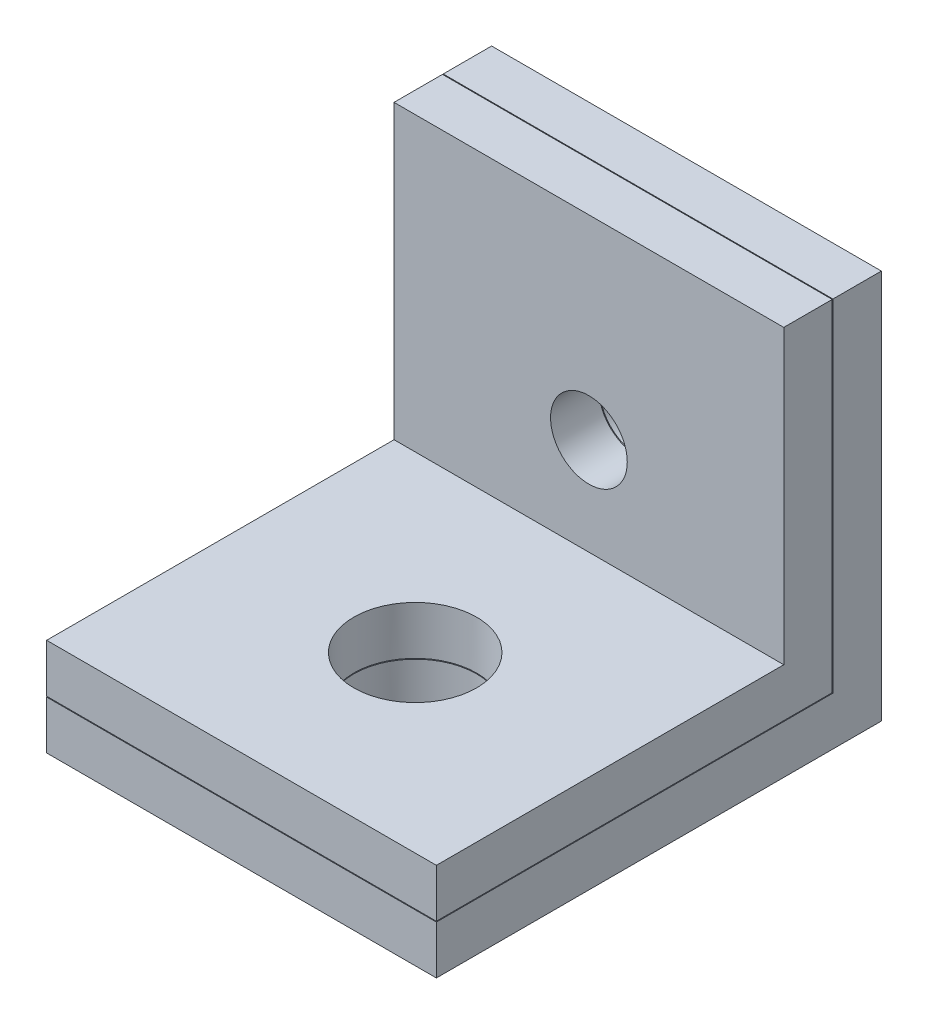
ISO-10303-21;
HEADER;
FILE_DESCRIPTION(('STEP AP214'),'2;1');
FILE_NAME('part.step','',(''),(''),'','','');
FILE_SCHEMA(('AUTOMOTIVE_DESIGN { 1 0 10303 214 1 1 1 1 }'));
ENDSEC;
DATA;
#1=APPLICATION_CONTEXT('core data for automotive mechanical design processes');
#2=APPLICATION_PROTOCOL_DEFINITION('international standard','automotive_design',2000,#1);
#3=PRODUCT_CONTEXT('',#1,'mechanical');
#4=PRODUCT('Part','Part','',(#3));
#5=PRODUCT_RELATED_PRODUCT_CATEGORY('part','',(#4));
#6=PRODUCT_DEFINITION_FORMATION('','',#4);
#7=PRODUCT_DEFINITION_CONTEXT('part definition',#1,'design');
#8=PRODUCT_DEFINITION('design','',#6,#7);
#9=PRODUCT_DEFINITION_SHAPE('','',#8);
#10=(LENGTH_UNIT() NAMED_UNIT(*) SI_UNIT(.MILLI.,.METRE.));
#11=(NAMED_UNIT(*) PLANE_ANGLE_UNIT() SI_UNIT($,.RADIAN.));
#12=(NAMED_UNIT(*) SI_UNIT($,.STERADIAN.) SOLID_ANGLE_UNIT());
#13=UNCERTAINTY_MEASURE_WITH_UNIT(LENGTH_MEASURE(1.E-05),#10,'distance_accuracy_value','');
#14=(GEOMETRIC_REPRESENTATION_CONTEXT(3) GLOBAL_UNCERTAINTY_ASSIGNED_CONTEXT((#13)) GLOBAL_UNIT_ASSIGNED_CONTEXT((#10,
#11,#12)) REPRESENTATION_CONTEXT('',''));
#15=CARTESIAN_POINT('',(0.,0.,0.));
#16=DIRECTION('',(0.,0.,1.));
#17=DIRECTION('',(1.,0.,0.));
#18=AXIS2_PLACEMENT_3D('',#15,#16,#17);
#19=CARTESIAN_POINT('',(50.8,50.8,-51.59));
#20=DIRECTION('',(0.,1.,0.));
#21=DIRECTION('',(0.,0.,1.));
#22=AXIS2_PLACEMENT_3D('',#19,#20,#21);
#23=PLANE('',#22);
#24=DIRECTION('',(0.,0.,-1.));
#25=VECTOR('',#24,1.);
#26=CARTESIAN_POINT('',(0.,50.8,-51.59));
#27=LINE('',#26,#25);
#28=CARTESIAN_POINT('',(0.,50.8,-45.28));
#29=VERTEX_POINT('',#28);
#30=CARTESIAN_POINT('',(0.,50.8,-51.59));
#31=VERTEX_POINT('',#30);
#32=EDGE_CURVE('E128',#29,#31,#27,.T.);
#33=ORIENTED_EDGE('',*,*,#32,.F.);
#34=DIRECTION('',(-1.,0.,0.));
#35=VECTOR('',#34,1.);
#36=CARTESIAN_POINT('',(50.8,50.8,-45.28));
#37=LINE('',#36,#35);
#38=CARTESIAN_POINT('',(50.8,50.8,-45.28));
#39=VERTEX_POINT('',#38);
#40=EDGE_CURVE('E12',#39,#29,#37,.T.);
#41=ORIENTED_EDGE('',*,*,#40,.F.);
#42=DIRECTION('',(0.,0.,-1.));
#43=VECTOR('',#42,1.);
#44=CARTESIAN_POINT('',(50.8,50.8,-51.59));
#45=LINE('',#44,#43);
#46=CARTESIAN_POINT('',(50.8,50.8,-51.59));
#47=VERTEX_POINT('',#46);
#48=EDGE_CURVE('E143',#39,#47,#45,.T.);
#49=ORIENTED_EDGE('',*,*,#48,.T.);
#50=DIRECTION('',(-1.,0.,0.));
#51=VECTOR('',#50,1.);
#52=CARTESIAN_POINT('',(50.8,50.8,-51.59));
#53=LINE('',#52,#51);
#54=EDGE_CURVE('E92',#47,#31,#53,.T.);
#55=ORIENTED_EDGE('',*,*,#54,.T.);
#56=EDGE_LOOP('',(#33,#41,#49,#55));
#57=FACE_BOUND('',#56,.T.);
#58=ADVANCED_FACE('F42',(#57),#23,.T.);
#59=CARTESIAN_POINT('',(50.8,12.72,-45.28));
#60=DIRECTION('',(0.,0.,1.));
#61=DIRECTION('',(1.,0.,0.));
#62=AXIS2_PLACEMENT_3D('',#59,#60,#61);
#63=PLANE('',#62);
#64=CARTESIAN_POINT('',(25.4,25.4,-45.28));
#65=DIRECTION('',(0.,0.,1.));
#66=DIRECTION('',(1.,0.,0.));
#67=AXIS2_PLACEMENT_3D('',#64,#65,#66);
#68=CIRCLE('',#67,5.);
#69=CARTESIAN_POINT('',(30.4,25.4,-45.28));
#70=VERTEX_POINT('',#69);
#71=EDGE_CURVE('E154',#70,#70,#68,.T.);
#72=ORIENTED_EDGE('',*,*,#71,.F.);
#73=EDGE_LOOP('',(#72));
#74=FACE_BOUND('',#73,.T.);
#75=DIRECTION('',(0.,1.,0.));
#76=VECTOR('',#75,1.);
#77=CARTESIAN_POINT('',(0.,12.72,-45.28));
#78=LINE('',#77,#76);
#79=CARTESIAN_POINT('',(0.,12.72,-45.28));
#80=VERTEX_POINT('',#79);
#81=EDGE_CURVE('E141',#80,#29,#78,.T.);
#82=ORIENTED_EDGE('',*,*,#81,.F.);
#83=DIRECTION('',(-1.,0.,0.));
#84=VECTOR('',#83,1.);
#85=CARTESIAN_POINT('',(50.8,12.72,-45.28));
#86=LINE('',#85,#84);
#87=CARTESIAN_POINT('',(50.8,12.72,-45.28));
#88=VERTEX_POINT('',#87);
#89=EDGE_CURVE('E51',#88,#80,#86,.T.);
#90=ORIENTED_EDGE('',*,*,#89,.F.);
#91=DIRECTION('',(0.,1.,0.));
#92=VECTOR('',#91,1.);
#93=CARTESIAN_POINT('',(50.8,12.72,-45.28));
#94=LINE('',#93,#92);
#95=EDGE_CURVE('E118',#88,#39,#94,.T.);
#96=ORIENTED_EDGE('',*,*,#95,.T.);
#97=ORIENTED_EDGE('',*,*,#40,.T.);
#98=EDGE_LOOP('',(#82,#90,#96,#97));
#99=FACE_BOUND('',#98,.T.);
#100=ADVANCED_FACE('F165',(#74,#99),#63,.T.);
#101=CARTESIAN_POINT('',(50.8,12.72,0.));
#102=DIRECTION('',(0.,1.,0.));
#103=DIRECTION('',(0.,0.,1.));
#104=AXIS2_PLACEMENT_3D('',#101,#102,#103);
#105=PLANE('',#104);
#106=CARTESIAN_POINT('',(25.4,12.72,-22.64));
#107=DIRECTION('',(0.,1.,0.));
#108=DIRECTION('',(0.,0.,1.));
#109=AXIS2_PLACEMENT_3D('',#106,#107,#108);
#110=CIRCLE('',#109,8.);
#111=CARTESIAN_POINT('',(25.4,12.72,-14.64));
#112=VERTEX_POINT('',#111);
#113=EDGE_CURVE('E150',#112,#112,#110,.T.);
#114=ORIENTED_EDGE('',*,*,#113,.F.);
#115=EDGE_LOOP('',(#114));
#116=FACE_BOUND('',#115,.T.);
#117=DIRECTION('',(0.,0.,-1.));
#118=VECTOR('',#117,1.);
#119=CARTESIAN_POINT('',(0.,12.72,0.));
#120=LINE('',#119,#118);
#121=CARTESIAN_POINT('',(0.,12.72,0.));
#122=VERTEX_POINT('',#121);
#123=EDGE_CURVE('E105',#122,#80,#120,.T.);
#124=ORIENTED_EDGE('',*,*,#123,.F.);
#125=DIRECTION('',(-1.,0.,0.));
#126=VECTOR('',#125,1.);
#127=CARTESIAN_POINT('',(50.8,12.72,0.));
#128=LINE('',#127,#126);
#129=CARTESIAN_POINT('',(50.8,12.72,0.));
#130=VERTEX_POINT('',#129);
#131=EDGE_CURVE('E100',#130,#122,#128,.T.);
#132=ORIENTED_EDGE('',*,*,#131,.F.);
#133=DIRECTION('',(0.,0.,-1.));
#134=VECTOR('',#133,1.);
#135=CARTESIAN_POINT('',(50.8,12.72,0.));
#136=LINE('',#135,#134);
#137=EDGE_CURVE('E103',#130,#88,#136,.T.);
#138=ORIENTED_EDGE('',*,*,#137,.T.);
#139=ORIENTED_EDGE('',*,*,#89,.T.);
#140=EDGE_LOOP('',(#124,#132,#138,#139));
#141=FACE_BOUND('',#140,.T.);
#142=ADVANCED_FACE('F102',(#116,#141),#105,.T.);
#143=CARTESIAN_POINT('',(50.8,6.41,0.));
#144=DIRECTION('',(0.,0.,1.));
#145=DIRECTION('',(0.,-1.,0.));
#146=AXIS2_PLACEMENT_3D('',#143,#144,#145);
#147=PLANE('',#146);
#148=DIRECTION('',(0.,1.,0.));
#149=VECTOR('',#148,1.);
#150=CARTESIAN_POINT('',(0.,6.41,0.));
#151=LINE('',#150,#149);
#152=CARTESIAN_POINT('',(0.,6.41,0.));
#153=VERTEX_POINT('',#152);
#154=EDGE_CURVE('E138',#153,#122,#151,.T.);
#155=ORIENTED_EDGE('',*,*,#154,.F.);
#156=DIRECTION('',(-1.,0.,0.));
#157=VECTOR('',#156,1.);
#158=CARTESIAN_POINT('',(50.8,6.41,0.));
#159=LINE('',#158,#157);
#160=CARTESIAN_POINT('',(50.8,6.41,0.));
#161=VERTEX_POINT('',#160);
#162=EDGE_CURVE('E110',#161,#153,#159,.T.);
#163=ORIENTED_EDGE('',*,*,#162,.F.);
#164=DIRECTION('',(0.,1.,0.));
#165=VECTOR('',#164,1.);
#166=CARTESIAN_POINT('',(50.8,6.41,0.));
#167=LINE('',#166,#165);
#168=EDGE_CURVE('E116',#161,#130,#167,.T.);
#169=ORIENTED_EDGE('',*,*,#168,.T.);
#170=ORIENTED_EDGE('',*,*,#131,.T.);
#171=EDGE_LOOP('',(#155,#163,#169,#170));
#172=FACE_BOUND('',#171,.T.);
#173=ADVANCED_FACE('F120',(#172),#147,.T.);
#174=CARTESIAN_POINT('',(50.8,6.41,-51.59));
#175=DIRECTION('',(0.,-1.,0.));
#176=DIRECTION('',(0.,0.,-1.));
#177=AXIS2_PLACEMENT_3D('',#174,#175,#176);
#178=PLANE('',#177);
#179=CARTESIAN_POINT('',(25.4,6.41,-22.64));
#180=DIRECTION('',(0.,-1.,0.));
#181=DIRECTION('',(0.,0.,-1.));
#182=AXIS2_PLACEMENT_3D('',#179,#180,#181);
#183=CIRCLE('',#182,8.);
#184=CARTESIAN_POINT('',(25.4,6.41,-30.64));
#185=VERTEX_POINT('',#184);
#186=EDGE_CURVE('E132',#185,#185,#183,.T.);
#187=ORIENTED_EDGE('',*,*,#186,.F.);
#188=EDGE_LOOP('',(#187));
#189=FACE_BOUND('',#188,.T.);
#190=DIRECTION('',(0.,0.,1.));
#191=VECTOR('',#190,1.);
#192=CARTESIAN_POINT('',(0.,6.41,-51.59));
#193=LINE('',#192,#191);
#194=CARTESIAN_POINT('',(0.,6.41,-51.59));
#195=VERTEX_POINT('',#194);
#196=EDGE_CURVE('E135',#195,#153,#193,.T.);
#197=ORIENTED_EDGE('',*,*,#196,.F.);
#198=DIRECTION('',(-1.,0.,0.));
#199=VECTOR('',#198,1.);
#200=CARTESIAN_POINT('',(50.8,6.41,-51.59));
#201=LINE('',#200,#199);
#202=CARTESIAN_POINT('',(50.8,6.41,-51.59));
#203=VERTEX_POINT('',#202);
#204=EDGE_CURVE('E147',#203,#195,#201,.T.);
#205=ORIENTED_EDGE('',*,*,#204,.F.);
#206=DIRECTION('',(0.,0.,1.));
#207=VECTOR('',#206,1.);
#208=CARTESIAN_POINT('',(50.8,6.41,-51.59));
#209=LINE('',#208,#207);
#210=EDGE_CURVE('E121',#203,#161,#209,.T.);
#211=ORIENTED_EDGE('',*,*,#210,.T.);
#212=ORIENTED_EDGE('',*,*,#162,.T.);
#213=EDGE_LOOP('',(#197,#205,#211,#212));
#214=FACE_BOUND('',#213,.T.);
#215=ADVANCED_FACE('F181',(#189,#214),#178,.T.);
#216=CARTESIAN_POINT('',(50.8,50.8,-51.59));
#217=DIRECTION('',(0.,0.,-1.));
#218=DIRECTION('',(0.,1.,0.));
#219=AXIS2_PLACEMENT_3D('',#216,#217,#218);
#220=PLANE('',#219);
#221=CARTESIAN_POINT('',(25.4,25.4,-51.59));
#222=DIRECTION('',(0.,0.,-1.));
#223=DIRECTION('',(0.,1.,0.));
#224=AXIS2_PLACEMENT_3D('',#221,#222,#223);
#225=CIRCLE('',#224,5.);
#226=CARTESIAN_POINT('',(25.4,30.4,-51.59));
#227=VERTEX_POINT('',#226);
#228=EDGE_CURVE('E45',#227,#227,#225,.T.);
#229=ORIENTED_EDGE('',*,*,#228,.F.);
#230=EDGE_LOOP('',(#229));
#231=FACE_BOUND('',#230,.T.);
#232=DIRECTION('',(0.,-1.,0.));
#233=VECTOR('',#232,1.);
#234=CARTESIAN_POINT('',(0.,50.8,-51.59));
#235=LINE('',#234,#233);
#236=EDGE_CURVE('E131',#31,#195,#235,.T.);
#237=ORIENTED_EDGE('',*,*,#236,.F.);
#238=ORIENTED_EDGE('',*,*,#54,.F.);
#239=DIRECTION('',(0.,-1.,0.));
#240=VECTOR('',#239,1.);
#241=CARTESIAN_POINT('',(50.8,50.8,-51.59));
#242=LINE('',#241,#240);
#243=EDGE_CURVE('E123',#47,#203,#242,.T.);
#244=ORIENTED_EDGE('',*,*,#243,.T.);
#245=ORIENTED_EDGE('',*,*,#204,.T.);
#246=EDGE_LOOP('',(#237,#238,#244,#245));
#247=FACE_BOUND('',#246,.T.);
#248=ADVANCED_FACE('F161',(#231,#247),#220,.T.);
#249=CARTESIAN_POINT('',(50.8,0.,0.));
#250=DIRECTION('',(-1.,0.,0.));
#251=DIRECTION('',(0.,0.,1.));
#252=AXIS2_PLACEMENT_3D('',#249,#250,#251);
#253=PLANE('',#252);
#254=ORIENTED_EDGE('',*,*,#48,.F.);
#255=ORIENTED_EDGE('',*,*,#95,.F.);
#256=ORIENTED_EDGE('',*,*,#137,.F.);
#257=ORIENTED_EDGE('',*,*,#168,.F.);
#258=ORIENTED_EDGE('',*,*,#210,.F.);
#259=ORIENTED_EDGE('',*,*,#243,.F.);
#260=EDGE_LOOP('',(#254,#255,#256,#257,#258,#259));
#261=FACE_BOUND('',#260,.T.);
#262=ADVANCED_FACE('F114',(#261),#253,.F.);
#263=CARTESIAN_POINT('',(0.,0.,0.));
#264=DIRECTION('',(-1.,0.,0.));
#265=DIRECTION('',(0.,0.,1.));
#266=AXIS2_PLACEMENT_3D('',#263,#264,#265);
#267=PLANE('',#266);
#268=ORIENTED_EDGE('',*,*,#32,.T.);
#269=ORIENTED_EDGE('',*,*,#236,.T.);
#270=ORIENTED_EDGE('',*,*,#196,.T.);
#271=ORIENTED_EDGE('',*,*,#154,.T.);
#272=ORIENTED_EDGE('',*,*,#123,.T.);
#273=ORIENTED_EDGE('',*,*,#81,.T.);
#274=EDGE_LOOP('',(#268,#269,#270,#271,#272,#273));
#275=FACE_BOUND('',#274,.T.);
#276=ADVANCED_FACE('F164',(#275),#267,.T.);
#277=CARTESIAN_POINT('',(25.4,-38.08,-22.64));
#278=DIRECTION('',(0.,1.,0.));
#279=DIRECTION('',(0.,0.,1.));
#280=AXIS2_PLACEMENT_3D('',#277,#278,#279);
#281=CYLINDRICAL_SURFACE('',#280,8.);
#282=ORIENTED_EDGE('',*,*,#186,.T.);
#283=EDGE_LOOP('',(#282));
#284=FACE_BOUND('',#283,.T.);
#285=ORIENTED_EDGE('',*,*,#113,.T.);
#286=EDGE_LOOP('',(#285));
#287=FACE_BOUND('',#286,.T.);
#288=ADVANCED_FACE('F194',(#284,#287),#281,.F.);
#289=CARTESIAN_POINT('',(25.4,25.4,-33.475));
#290=DIRECTION('',(0.,0.,-1.));
#291=DIRECTION('',(-1.,0.,0.));
#292=AXIS2_PLACEMENT_3D('',#289,#290,#291);
#293=CYLINDRICAL_SURFACE('',#292,5.);
#294=ORIENTED_EDGE('',*,*,#71,.T.);
#295=EDGE_LOOP('',(#294));
#296=FACE_BOUND('',#295,.T.);
#297=ORIENTED_EDGE('',*,*,#228,.T.);
#298=EDGE_LOOP('',(#297));
#299=FACE_BOUND('',#298,.T.);
#300=ADVANCED_FACE('F192',(#296,#299),#293,.F.);
#301=CLOSED_SHELL('',(#58,#100,#142,#173,#215,#248,#262,#276,#288,#300));
#302=MANIFOLD_SOLID_BREP('B2',#301);
#303=CARTESIAN_POINT('',(50.8,6.31,0.));
#304=DIRECTION('',(0.,0.,-1.));
#305=DIRECTION('',(-1.,0.,0.));
#306=AXIS2_PLACEMENT_3D('',#303,#304,#305);
#307=PLANE('',#306);
#308=DIRECTION('',(0.,-1.,0.));
#309=VECTOR('',#308,1.);
#310=CARTESIAN_POINT('',(0.,6.31,0.));
#311=LINE('',#310,#309);
#312=CARTESIAN_POINT('',(0.,6.31,0.));
#313=VERTEX_POINT('',#312);
#314=CARTESIAN_POINT('',(0.,0.,0.));
#315=VERTEX_POINT('',#314);
#316=EDGE_CURVE('E345',#313,#315,#311,.T.);
#317=ORIENTED_EDGE('',*,*,#316,.T.);
#318=DIRECTION('',(-1.,0.,0.));
#319=VECTOR('',#318,1.);
#320=CARTESIAN_POINT('',(50.8,0.,0.));
#321=LINE('',#320,#319);
#322=CARTESIAN_POINT('',(50.8,0.,0.));
#323=VERTEX_POINT('',#322);
#324=EDGE_CURVE('E40',#323,#315,#321,.T.);
#325=ORIENTED_EDGE('',*,*,#324,.F.);
#326=DIRECTION('',(0.,-1.,0.));
#327=VECTOR('',#326,1.);
#328=CARTESIAN_POINT('',(50.8,6.31,0.));
#329=LINE('',#328,#327);
#330=CARTESIAN_POINT('',(50.8,6.31,0.));
#331=VERTEX_POINT('',#330);
#332=EDGE_CURVE('E356',#331,#323,#329,.T.);
#333=ORIENTED_EDGE('',*,*,#332,.F.);
#334=DIRECTION('',(-1.,0.,0.));
#335=VECTOR('',#334,1.);
#336=CARTESIAN_POINT('',(50.8,6.31,0.));
#337=LINE('',#336,#335);
#338=EDGE_CURVE('E341',#331,#313,#337,.T.);
#339=ORIENTED_EDGE('',*,*,#338,.T.);
#340=EDGE_LOOP('',(#317,#325,#333,#339));
#341=FACE_BOUND('',#340,.T.);
#342=ADVANCED_FACE('F259',(#341),#307,.F.);
#343=CARTESIAN_POINT('',(50.8,0.,0.));
#344=DIRECTION('',(0.,1.,0.));
#345=DIRECTION('',(0.,0.,1.));
#346=AXIS2_PLACEMENT_3D('',#343,#344,#345);
#347=PLANE('',#346);
#348=CARTESIAN_POINT('',(25.4,0.,-22.64));
#349=DIRECTION('',(0.,1.,0.));
#350=DIRECTION('',(0.,0.,1.));
#351=AXIS2_PLACEMENT_3D('',#348,#349,#350);
#352=CIRCLE('',#351,8.);
#353=CARTESIAN_POINT('',(25.4,0.,-14.64));
#354=VERTEX_POINT('',#353);
#355=EDGE_CURVE('E349',#354,#354,#352,.T.);
#356=ORIENTED_EDGE('',*,*,#355,.T.);
#357=EDGE_LOOP('',(#356));
#358=FACE_BOUND('',#357,.T.);
#359=DIRECTION('',(0.,0.,-1.));
#360=VECTOR('',#359,1.);
#361=CARTESIAN_POINT('',(0.,0.,0.));
#362=LINE('',#361,#360);
#363=CARTESIAN_POINT('',(0.,0.,-58.));
#364=VERTEX_POINT('',#363);
#365=EDGE_CURVE('E348',#315,#364,#362,.T.);
#366=ORIENTED_EDGE('',*,*,#365,.T.);
#367=DIRECTION('',(-1.,0.,0.));
#368=VECTOR('',#367,1.);
#369=CARTESIAN_POINT('',(50.8,0.,-58.));
#370=LINE('',#369,#368);
#371=CARTESIAN_POINT('',(50.8,0.,-58.));
#372=VERTEX_POINT('',#371);
#373=EDGE_CURVE('E268',#372,#364,#370,.T.);
#374=ORIENTED_EDGE('',*,*,#373,.F.);
#375=DIRECTION('',(0.,0.,-1.));
#376=VECTOR('',#375,1.);
#377=CARTESIAN_POINT('',(50.8,0.,0.));
#378=LINE('',#377,#376);
#379=EDGE_CURVE('E314',#323,#372,#378,.T.);
#380=ORIENTED_EDGE('',*,*,#379,.F.);
#381=ORIENTED_EDGE('',*,*,#324,.T.);
#382=EDGE_LOOP('',(#366,#374,#380,#381));
#383=FACE_BOUND('',#382,.T.);
#384=ADVANCED_FACE('F379',(#358,#383),#347,.F.);
#385=CARTESIAN_POINT('',(50.8,0.,-58.));
#386=DIRECTION('',(0.,0.,1.));
#387=DIRECTION('',(1.,0.,0.));
#388=AXIS2_PLACEMENT_3D('',#385,#386,#387);
#389=PLANE('',#388);
#390=CARTESIAN_POINT('',(25.4,25.4,-58.));
#391=DIRECTION('',(0.,0.,-1.));
#392=DIRECTION('',(-1.,0.,0.));
#393=AXIS2_PLACEMENT_3D('',#390,#391,#392);
#394=CIRCLE('',#393,5.);
#395=CARTESIAN_POINT('',(20.4,25.4,-58.));
#396=VERTEX_POINT('',#395);
#397=EDGE_CURVE('E368',#396,#396,#394,.T.);
#398=ORIENTED_EDGE('',*,*,#397,.F.);
#399=EDGE_LOOP('',(#398));
#400=FACE_BOUND('',#399,.T.);
#401=DIRECTION('',(0.,1.,0.));
#402=VECTOR('',#401,1.);
#403=CARTESIAN_POINT('',(0.,0.,-58.));
#404=LINE('',#403,#402);
#405=CARTESIAN_POINT('',(0.,50.8,-58.));
#406=VERTEX_POINT('',#405);
#407=EDGE_CURVE('E351',#364,#406,#404,.T.);
#408=ORIENTED_EDGE('',*,*,#407,.T.);
#409=DIRECTION('',(-1.,0.,0.));
#410=VECTOR('',#409,1.);
#411=CARTESIAN_POINT('',(50.8,50.8,-58.));
#412=LINE('',#411,#410);
#413=CARTESIAN_POINT('',(50.8,50.8,-58.));
#414=VERTEX_POINT('',#413);
#415=EDGE_CURVE('E336',#414,#406,#412,.T.);
#416=ORIENTED_EDGE('',*,*,#415,.F.);
#417=DIRECTION('',(0.,1.,0.));
#418=VECTOR('',#417,1.);
#419=CARTESIAN_POINT('',(50.8,0.,-58.));
#420=LINE('',#419,#418);
#421=EDGE_CURVE('E327',#372,#414,#420,.T.);
#422=ORIENTED_EDGE('',*,*,#421,.F.);
#423=ORIENTED_EDGE('',*,*,#373,.T.);
#424=EDGE_LOOP('',(#408,#416,#422,#423));
#425=FACE_BOUND('',#424,.T.);
#426=ADVANCED_FACE('F382',(#400,#425),#389,.F.);
#427=CARTESIAN_POINT('',(50.8,50.8,-51.69));
#428=DIRECTION('',(0.,-1.,0.));
#429=DIRECTION('',(0.,0.,-1.));
#430=AXIS2_PLACEMENT_3D('',#427,#428,#429);
#431=PLANE('',#430);
#432=DIRECTION('',(0.,0.,1.));
#433=VECTOR('',#432,1.);
#434=CARTESIAN_POINT('',(0.,50.8,-51.69));
#435=LINE('',#434,#433);
#436=CARTESIAN_POINT('',(0.,50.8,-51.69));
#437=VERTEX_POINT('',#436);
#438=EDGE_CURVE('E335',#406,#437,#435,.T.);
#439=ORIENTED_EDGE('',*,*,#438,.T.);
#440=DIRECTION('',(-1.,0.,0.));
#441=VECTOR('',#440,1.);
#442=CARTESIAN_POINT('',(50.8,50.8,-51.69));
#443=LINE('',#442,#441);
#444=CARTESIAN_POINT('',(50.8,50.8,-51.69));
#445=VERTEX_POINT('',#444);
#446=EDGE_CURVE('E332',#445,#437,#443,.T.);
#447=ORIENTED_EDGE('',*,*,#446,.F.);
#448=DIRECTION('',(0.,0.,1.));
#449=VECTOR('',#448,1.);
#450=CARTESIAN_POINT('',(50.8,50.8,-51.69));
#451=LINE('',#450,#449);
#452=EDGE_CURVE('E321',#414,#445,#451,.T.);
#453=ORIENTED_EDGE('',*,*,#452,.F.);
#454=ORIENTED_EDGE('',*,*,#415,.T.);
#455=EDGE_LOOP('',(#439,#447,#453,#454));
#456=FACE_BOUND('',#455,.T.);
#457=ADVANCED_FACE('F333',(#456),#431,.F.);
#458=CARTESIAN_POINT('',(50.8,6.31,-51.69));
#459=DIRECTION('',(0.,0.,-1.));
#460=DIRECTION('',(-1.,0.,0.));
#461=AXIS2_PLACEMENT_3D('',#458,#459,#460);
#462=PLANE('',#461);
#463=CARTESIAN_POINT('',(25.4,25.4,-51.69));
#464=DIRECTION('',(0.,0.,-1.));
#465=DIRECTION('',(-1.,0.,0.));
#466=AXIS2_PLACEMENT_3D('',#463,#464,#465);
#467=CIRCLE('',#466,5.);
#468=CARTESIAN_POINT('',(20.4,25.4,-51.69));
#469=VERTEX_POINT('',#468);
#470=EDGE_CURVE('E262',#469,#469,#467,.T.);
#471=ORIENTED_EDGE('',*,*,#470,.T.);
#472=EDGE_LOOP('',(#471));
#473=FACE_BOUND('',#472,.T.);
#474=DIRECTION('',(0.,-1.,0.));
#475=VECTOR('',#474,1.);
#476=CARTESIAN_POINT('',(0.,6.31,-51.69));
#477=LINE('',#476,#475);
#478=CARTESIAN_POINT('',(0.,6.31,-51.69));
#479=VERTEX_POINT('',#478);
#480=EDGE_CURVE('E300',#437,#479,#477,.T.);
#481=ORIENTED_EDGE('',*,*,#480,.T.);
#482=DIRECTION('',(-1.,0.,0.));
#483=VECTOR('',#482,1.);
#484=CARTESIAN_POINT('',(50.8,6.31,-51.69));
#485=LINE('',#484,#483);
#486=CARTESIAN_POINT('',(50.8,6.31,-51.69));
#487=VERTEX_POINT('',#486);
#488=EDGE_CURVE('E337',#487,#479,#485,.T.);
#489=ORIENTED_EDGE('',*,*,#488,.F.);
#490=DIRECTION('',(0.,-1.,0.));
#491=VECTOR('',#490,1.);
#492=CARTESIAN_POINT('',(50.8,6.31,-51.69));
#493=LINE('',#492,#491);
#494=EDGE_CURVE('E325',#445,#487,#493,.T.);
#495=ORIENTED_EDGE('',*,*,#494,.F.);
#496=ORIENTED_EDGE('',*,*,#446,.T.);
#497=EDGE_LOOP('',(#481,#489,#495,#496));
#498=FACE_BOUND('',#497,.T.);
#499=ADVANCED_FACE('F339',(#473,#498),#462,.F.);
#500=CARTESIAN_POINT('',(50.8,6.31,0.));
#501=DIRECTION('',(0.,-1.,0.));
#502=DIRECTION('',(0.,0.,-1.));
#503=AXIS2_PLACEMENT_3D('',#500,#501,#502);
#504=PLANE('',#503);
#505=CARTESIAN_POINT('',(25.4,6.31,-22.64));
#506=DIRECTION('',(0.,-1.,0.));
#507=DIRECTION('',(0.,0.,-1.));
#508=AXIS2_PLACEMENT_3D('',#505,#506,#507);
#509=CIRCLE('',#508,8.);
#510=CARTESIAN_POINT('',(25.4,6.31,-30.64));
#511=VERTEX_POINT('',#510);
#512=EDGE_CURVE('E361',#511,#511,#509,.T.);
#513=ORIENTED_EDGE('',*,*,#512,.T.);
#514=EDGE_LOOP('',(#513));
#515=FACE_BOUND('',#514,.T.);
#516=DIRECTION('',(0.,0.,1.));
#517=VECTOR('',#516,1.);
#518=CARTESIAN_POINT('',(0.,6.31,0.));
#519=LINE('',#518,#517);
#520=EDGE_CURVE('E306',#479,#313,#519,.T.);
#521=ORIENTED_EDGE('',*,*,#520,.T.);
#522=ORIENTED_EDGE('',*,*,#338,.F.);
#523=DIRECTION('',(0.,0.,1.));
#524=VECTOR('',#523,1.);
#525=CARTESIAN_POINT('',(50.8,6.31,0.));
#526=LINE('',#525,#524);
#527=EDGE_CURVE('E277',#487,#331,#526,.T.);
#528=ORIENTED_EDGE('',*,*,#527,.F.);
#529=ORIENTED_EDGE('',*,*,#488,.T.);
#530=EDGE_LOOP('',(#521,#522,#528,#529));
#531=FACE_BOUND('',#530,.T.);
#532=ADVANCED_FACE('F387',(#515,#531),#504,.F.);
#533=CARTESIAN_POINT('',(50.8,0.,0.));
#534=DIRECTION('',(1.,0.,0.));
#535=DIRECTION('',(0.,0.,-1.));
#536=AXIS2_PLACEMENT_3D('',#533,#534,#535);
#537=PLANE('',#536);
#538=ORIENTED_EDGE('',*,*,#332,.T.);
#539=ORIENTED_EDGE('',*,*,#379,.T.);
#540=ORIENTED_EDGE('',*,*,#421,.T.);
#541=ORIENTED_EDGE('',*,*,#452,.T.);
#542=ORIENTED_EDGE('',*,*,#494,.T.);
#543=ORIENTED_EDGE('',*,*,#527,.T.);
#544=EDGE_LOOP('',(#538,#539,#540,#541,#542,#543));
#545=FACE_BOUND('',#544,.T.);
#546=ADVANCED_FACE('F323',(#545),#537,.T.);
#547=CARTESIAN_POINT('',(0.,0.,0.));
#548=DIRECTION('',(1.,0.,0.));
#549=DIRECTION('',(0.,0.,-1.));
#550=AXIS2_PLACEMENT_3D('',#547,#548,#549);
#551=PLANE('',#550);
#552=ORIENTED_EDGE('',*,*,#316,.F.);
#553=ORIENTED_EDGE('',*,*,#520,.F.);
#554=ORIENTED_EDGE('',*,*,#480,.F.);
#555=ORIENTED_EDGE('',*,*,#438,.F.);
#556=ORIENTED_EDGE('',*,*,#407,.F.);
#557=ORIENTED_EDGE('',*,*,#365,.F.);
#558=EDGE_LOOP('',(#552,#553,#554,#555,#556,#557));
#559=FACE_BOUND('',#558,.T.);
#560=ADVANCED_FACE('F385',(#559),#551,.F.);
#561=CARTESIAN_POINT('',(25.4,-38.08,-22.64));
#562=DIRECTION('',(0.,1.,0.));
#563=DIRECTION('',(0.,0.,1.));
#564=AXIS2_PLACEMENT_3D('',#561,#562,#563);
#565=CYLINDRICAL_SURFACE('',#564,8.);
#566=ORIENTED_EDGE('',*,*,#512,.F.);
#567=EDGE_LOOP('',(#566));
#568=FACE_BOUND('',#567,.T.);
#569=ORIENTED_EDGE('',*,*,#355,.F.);
#570=EDGE_LOOP('',(#569));
#571=FACE_BOUND('',#570,.T.);
#572=ADVANCED_FACE('F431',(#568,#571),#565,.F.);
#573=CARTESIAN_POINT('',(25.4,25.4,-33.475));
#574=DIRECTION('',(0.,0.,-1.));
#575=DIRECTION('',(-1.,0.,0.));
#576=AXIS2_PLACEMENT_3D('',#573,#574,#575);
#577=CYLINDRICAL_SURFACE('',#576,5.);
#578=ORIENTED_EDGE('',*,*,#397,.T.);
#579=EDGE_LOOP('',(#578));
#580=FACE_BOUND('',#579,.T.);
#581=ORIENTED_EDGE('',*,*,#470,.F.);
#582=EDGE_LOOP('',(#581));
#583=FACE_BOUND('',#582,.T.);
#584=ADVANCED_FACE('F427',(#580,#583),#577,.F.);
#585=CLOSED_SHELL('',(#342,#384,#426,#457,#499,#532,#546,#560,#572,#584));
#586=MANIFOLD_SOLID_BREP('B6',#585);
#587=ADVANCED_BREP_SHAPE_REPRESENTATION('',(#18,#302,#586),#14);
#588=SHAPE_DEFINITION_REPRESENTATION(#9,#587);
ENDSEC;
END-ISO-10303-21;
